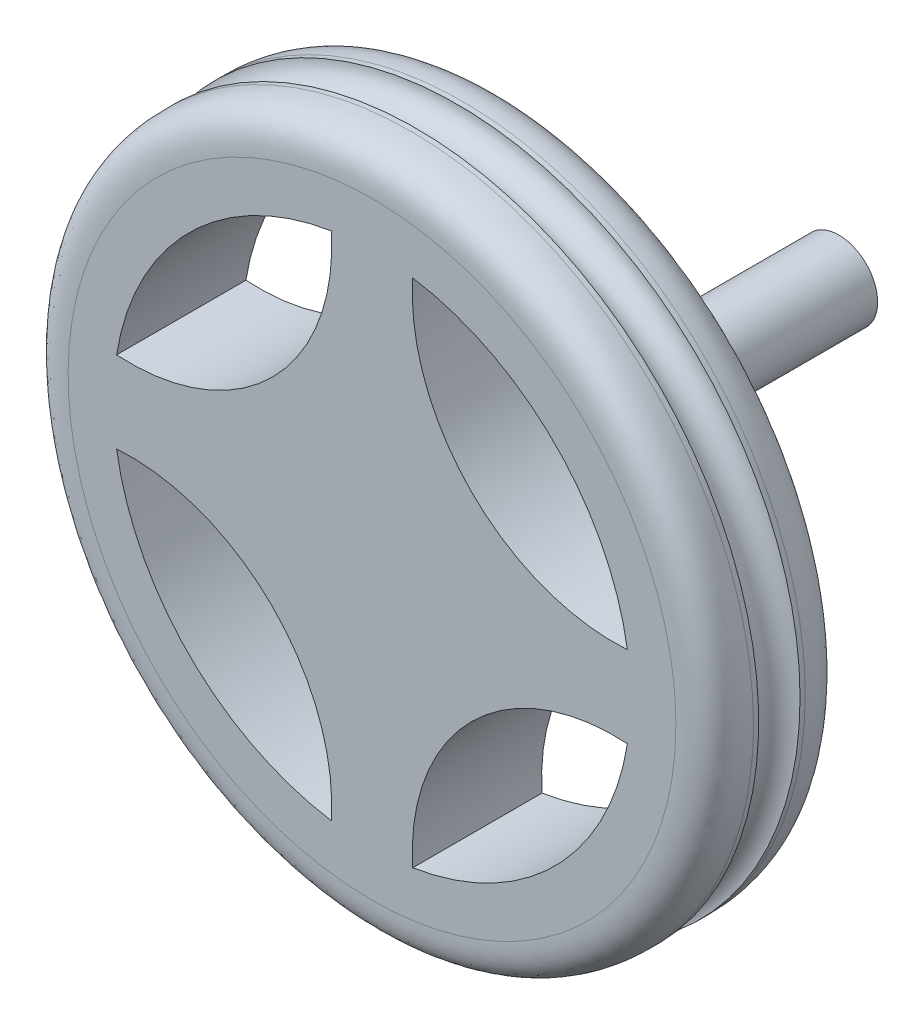
ISO-10303-21;
HEADER;
FILE_DESCRIPTION(('STEP AP214'),'2;1');
FILE_NAME('part.step','',(''),(''),'','','');
FILE_SCHEMA(('AUTOMOTIVE_DESIGN { 1 0 10303 214 1 1 1 1 }'));
ENDSEC;
DATA;
#1=APPLICATION_CONTEXT('core data for automotive mechanical design processes');
#2=APPLICATION_PROTOCOL_DEFINITION('international standard','automotive_design',2000,#1);
#3=PRODUCT_CONTEXT('',#1,'mechanical');
#4=PRODUCT('Part','Part','',(#3));
#5=PRODUCT_RELATED_PRODUCT_CATEGORY('part','',(#4));
#6=PRODUCT_DEFINITION_FORMATION('','',#4);
#7=PRODUCT_DEFINITION_CONTEXT('part definition',#1,'design');
#8=PRODUCT_DEFINITION('design','',#6,#7);
#9=PRODUCT_DEFINITION_SHAPE('','',#8);
#10=(LENGTH_UNIT() NAMED_UNIT(*) SI_UNIT(.MILLI.,.METRE.));
#11=(NAMED_UNIT(*) PLANE_ANGLE_UNIT() SI_UNIT($,.RADIAN.));
#12=(NAMED_UNIT(*) SI_UNIT($,.STERADIAN.) SOLID_ANGLE_UNIT());
#13=UNCERTAINTY_MEASURE_WITH_UNIT(LENGTH_MEASURE(1.E-05),#10,'distance_accuracy_value','');
#14=(GEOMETRIC_REPRESENTATION_CONTEXT(3) GLOBAL_UNCERTAINTY_ASSIGNED_CONTEXT((#13)) GLOBAL_UNIT_ASSIGNED_CONTEXT((#10,
#11,#12)) REPRESENTATION_CONTEXT('',''));
#15=CARTESIAN_POINT('',(0.,0.,0.));
#16=DIRECTION('',(0.,0.,1.));
#17=DIRECTION('',(1.,0.,0.));
#18=AXIS2_PLACEMENT_3D('',#15,#16,#17);
#19=CARTESIAN_POINT('',(4.49639746502567,34.7438056757314,20.));
#20=DIRECTION('',(0.,0.,-1.));
#21=DIRECTION('',(-1.,0.,0.));
#22=AXIS2_PLACEMENT_3D('',#19,#20,#21);
#23=CYLINDRICAL_SURFACE('',#22,26.5);
#24=CARTESIAN_POINT('',(30.9963974650257,34.7438056757314,17.));
#25=CARTESIAN_POINT('',(30.9963974650257,38.2121807728972,17.));
#26=CARTESIAN_POINT('',(29.6165920619499,45.1489309672287,17.));
#27=CARTESIAN_POINT('',(23.7225620450856,53.9699702557912,17.));
#28=CARTESIAN_POINT('',(14.9015227565231,59.8640002726556,17.));
#29=CARTESIAN_POINT('',(4.49639746502556,61.9337083772693,17.));
#30=CARTESIAN_POINT('',(-5.9087278264716,59.8640002726556,17.));
#31=CARTESIAN_POINT('',(-14.7297671150342,53.9699702557913,17.));
#32=CARTESIAN_POINT('',(-20.6237971318985,45.1489309672288,17.));
#33=CARTESIAN_POINT('',(-22.6935052365122,34.7438056757313,17.));
#34=CARTESIAN_POINT('',(-20.6237971318986,24.3386803842342,17.));
#35=CARTESIAN_POINT('',(-14.7297671150342,15.5176410956715,17.));
#36=CARTESIAN_POINT('',(-5.90872782647176,9.62361107880723,17.));
#37=CARTESIAN_POINT('',(4.49639746502572,7.55390297419349,17.));
#38=CARTESIAN_POINT('',(14.901522756523,9.62361107880719,17.));
#39=CARTESIAN_POINT('',(23.7225620450856,15.5176410956715,17.));
#40=CARTESIAN_POINT('',(29.6165920619499,24.3386803842341,17.));
#41=CARTESIAN_POINT('',(30.9963974650257,31.2754305785656,17.));
#42=CARTESIAN_POINT('',(30.9963974650257,34.7438056757314,17.));
#43=B_SPLINE_CURVE_WITH_KNOTS('',3,(#24,#25,#26,#27,#28,#29,#30,#31,#32,#33,#34,#35,#36,#37,#38,
#39,#40,#41,#42),.UNSPECIFIED.,.T.,.F.,(4,1,1,1,1,1,1,1,1,1,1,1,1,1,1,1,4),(-6.28318530717959,
-5.89048622548086,-5.49778714378214,-5.10508806208341,-4.71238898038469,-4.31968989868597,
-3.92699081698724,-3.53429173528852,-3.14159265358979,-2.74889357189107,-2.35619449019235,
-1.96349540849362,-1.5707963267949,-1.17809724509617,-0.785398163397448,-0.392699081698724,0.),.UNSPECIFIED.);
#44=CARTESIAN_POINT('',(30.9963974650257,34.7438056757314,17.));
#45=VERTEX_POINT('',#44);
#46=EDGE_CURVE('E175',#45,#45,#43,.F.);
#47=ORIENTED_EDGE('',*,*,#46,.T.);
#48=EDGE_LOOP('',(#47));
#49=FACE_BOUND('',#48,.T.);
#50=CARTESIAN_POINT('',(4.49639746502567,34.7438056757314,16.6));
#51=DIRECTION('',(0.,0.,-1.));
#52=DIRECTION('',(-1.,0.,0.));
#53=AXIS2_PLACEMENT_3D('',#50,#51,#52);
#54=CIRCLE('',#53,26.5);
#55=CARTESIAN_POINT('',(-22.0036025349743,34.7438056757314,16.6));
#56=VERTEX_POINT('',#55);
#57=EDGE_CURVE('E145',#56,#56,#54,.F.);
#58=ORIENTED_EDGE('',*,*,#57,.T.);
#59=EDGE_LOOP('',(#58));
#60=FACE_BOUND('',#59,.T.);
#61=ADVANCED_FACE('F41',(#49,#60),#23,.T.);
#62=CARTESIAN_POINT('',(30.9963974650257,34.7438056757314,13.));
#63=CARTESIAN_POINT('',(30.9963974650257,31.2754305785656,13.));
#64=CARTESIAN_POINT('',(29.6165920619499,24.3386803842341,13.));
#65=CARTESIAN_POINT('',(23.7225620450856,15.5176410956715,13.));
#66=CARTESIAN_POINT('',(14.901522756523,9.62361107880719,13.));
#67=CARTESIAN_POINT('',(4.49639746502572,7.55390297419349,13.));
#68=CARTESIAN_POINT('',(-5.90872782647176,9.62361107880723,13.));
#69=CARTESIAN_POINT('',(-14.7297671150342,15.5176410956715,13.));
#70=CARTESIAN_POINT('',(-20.6237971318986,24.3386803842342,13.));
#71=CARTESIAN_POINT('',(-22.6935052365122,34.7438056757313,13.));
#72=CARTESIAN_POINT('',(-20.6237971318985,45.1489309672288,13.));
#73=CARTESIAN_POINT('',(-14.7297671150342,53.9699702557913,13.));
#74=CARTESIAN_POINT('',(-5.9087278264716,59.8640002726556,13.));
#75=CARTESIAN_POINT('',(4.49639746502556,61.9337083772693,13.));
#76=CARTESIAN_POINT('',(14.9015227565231,59.8640002726556,13.));
#77=CARTESIAN_POINT('',(23.7225620450856,53.9699702557912,13.));
#78=CARTESIAN_POINT('',(29.6165920619499,45.1489309672287,13.));
#79=CARTESIAN_POINT('',(30.9963974650257,38.2121807728972,13.));
#80=CARTESIAN_POINT('',(30.9963974650257,34.7438056757314,13.));
#81=B_SPLINE_CURVE_WITH_KNOTS('',3,(#62,#63,#64,#65,#66,#67,#68,#69,#70,#71,#72,#73,#74,#75,#76,
#77,#78,#79,#80),.UNSPECIFIED.,.T.,.F.,(4,1,1,1,1,1,1,1,1,1,1,1,1,1,1,1,4),(-6.28318530717959,
-5.89048622548086,-5.49778714378214,-5.10508806208341,-4.71238898038469,-4.31968989868597,
-3.92699081698724,-3.53429173528852,-3.14159265358979,-2.74889357189107,-2.35619449019234,
-1.96349540849362,-1.5707963267949,-1.17809724509617,-0.785398163397448,-0.392699081698724,0.),.UNSPECIFIED.);
#82=CARTESIAN_POINT('',(30.9963974650257,34.7438056757314,13.));
#83=VERTEX_POINT('',#82);
#84=EDGE_CURVE('E53',#83,#83,#81,.F.);
#85=ORIENTED_EDGE('',*,*,#84,.T.);
#86=EDGE_LOOP('',(#85));
#87=FACE_BOUND('',#86,.T.);
#88=CARTESIAN_POINT('',(4.49639746502567,34.7438056757314,13.4));
#89=DIRECTION('',(0.,0.,1.));
#90=DIRECTION('',(1.,0.,0.));
#91=AXIS2_PLACEMENT_3D('',#88,#89,#90);
#92=CIRCLE('',#91,26.5);
#93=CARTESIAN_POINT('',(30.9963974650257,34.7438056757314,13.4));
#94=VERTEX_POINT('',#93);
#95=EDGE_CURVE('E176',#94,#94,#92,.F.);
#96=ORIENTED_EDGE('',*,*,#95,.T.);
#97=EDGE_LOOP('',(#96));
#98=FACE_BOUND('',#97,.T.);
#99=ADVANCED_FACE('F199',(#87,#98),#23,.T.);
#100=CARTESIAN_POINT('',(23.2347271664692,16.0054759742879,20.));
#101=DIRECTION('',(0.,0.,-1.));
#102=DIRECTION('',(-1.,0.,0.));
#103=AXIS2_PLACEMENT_3D('',#100,#101,#102);
#104=CYLINDRICAL_SURFACE('',#103,15.6240206666318);
#105=CARTESIAN_POINT('',(23.2347271664692,16.0054759742879,10.));
#106=DIRECTION('',(0.,0.,1.));
#107=DIRECTION('',(1.,0.,0.));
#108=AXIS2_PLACEMENT_3D('',#105,#106,#107);
#109=CIRCLE('',#108,15.6240206666318);
#110=CARTESIAN_POINT('',(7.64354834771268,14.9929717358289,10.));
#111=VERTEX_POINT('',#110);
#112=CARTESIAN_POINT('',(24.2472314049281,31.5966547930444,10.));
#113=VERTEX_POINT('',#112);
#114=EDGE_CURVE('E140',#111,#113,#109,.F.);
#115=ORIENTED_EDGE('',*,*,#114,.T.);
#116=DIRECTION('',(0.,0.,-1.));
#117=VECTOR('',#116,1.);
#118=CARTESIAN_POINT('',(24.2472314049281,31.5966547930444,20.));
#119=LINE('',#118,#117);
#120=CARTESIAN_POINT('',(24.2472314049281,31.5966547930444,20.));
#121=VERTEX_POINT('',#120);
#122=EDGE_CURVE('E170',#121,#113,#119,.T.);
#123=ORIENTED_EDGE('',*,*,#122,.F.);
#124=CARTESIAN_POINT('',(23.2347271664692,16.0054759742879,20.));
#125=DIRECTION('',(0.,0.,1.));
#126=DIRECTION('',(1.,0.,0.));
#127=AXIS2_PLACEMENT_3D('',#124,#125,#126);
#128=CIRCLE('',#127,15.6240206666318);
#129=CARTESIAN_POINT('',(7.64354834771268,14.9929717358289,20.));
#130=VERTEX_POINT('',#129);
#131=EDGE_CURVE('E95',#130,#121,#128,.F.);
#132=ORIENTED_EDGE('',*,*,#131,.F.);
#133=DIRECTION('',(0.,0.,-1.));
#134=VECTOR('',#133,1.);
#135=CARTESIAN_POINT('',(7.64354834771268,14.9929717358289,20.));
#136=LINE('',#135,#134);
#137=EDGE_CURVE('E173',#130,#111,#136,.T.);
#138=ORIENTED_EDGE('',*,*,#137,.T.);
#139=EDGE_LOOP('',(#115,#123,#132,#138));
#140=FACE_BOUND('',#139,.T.);
#141=ADVANCED_FACE('F239',(#140),#104,.F.);
#142=CARTESIAN_POINT('',(23.2347271664692,53.4821353771749,20.));
#143=DIRECTION('',(0.,0.,-1.));
#144=DIRECTION('',(-1.,0.,0.));
#145=AXIS2_PLACEMENT_3D('',#142,#143,#144);
#146=CYLINDRICAL_SURFACE('',#145,15.6240206666318);
#147=CARTESIAN_POINT('',(23.2347271664692,53.4821353771749,10.));
#148=DIRECTION('',(0.,0.,1.));
#149=DIRECTION('',(1.,0.,0.));
#150=AXIS2_PLACEMENT_3D('',#147,#148,#149);
#151=CIRCLE('',#150,15.6240206666318);
#152=CARTESIAN_POINT('',(7.64354834771268,54.4946396156338,10.));
#153=VERTEX_POINT('',#152);
#154=CARTESIAN_POINT('',(24.2472314049281,37.8909565584184,10.));
#155=VERTEX_POINT('',#154);
#156=EDGE_CURVE('E156',#153,#155,#151,.T.);
#157=ORIENTED_EDGE('',*,*,#156,.F.);
#158=DIRECTION('',(0.,0.,-1.));
#159=VECTOR('',#158,1.);
#160=CARTESIAN_POINT('',(7.64354834771268,54.4946396156338,20.));
#161=LINE('',#160,#159);
#162=CARTESIAN_POINT('',(7.64354834771268,54.4946396156338,20.));
#163=VERTEX_POINT('',#162);
#164=EDGE_CURVE('E164',#163,#153,#161,.T.);
#165=ORIENTED_EDGE('',*,*,#164,.F.);
#166=CARTESIAN_POINT('',(23.2347271664692,53.4821353771749,20.));
#167=DIRECTION('',(0.,0.,1.));
#168=DIRECTION('',(1.,0.,0.));
#169=AXIS2_PLACEMENT_3D('',#166,#167,#168);
#170=CIRCLE('',#169,15.6240206666318);
#171=CARTESIAN_POINT('',(24.2472314049281,37.8909565584184,20.));
#172=VERTEX_POINT('',#171);
#173=EDGE_CURVE('E122',#163,#172,#170,.T.);
#174=ORIENTED_EDGE('',*,*,#173,.T.);
#175=DIRECTION('',(0.,0.,-1.));
#176=VECTOR('',#175,1.);
#177=CARTESIAN_POINT('',(24.2472314049281,37.8909565584184,20.));
#178=LINE('',#177,#176);
#179=EDGE_CURVE('E167',#172,#155,#178,.T.);
#180=ORIENTED_EDGE('',*,*,#179,.T.);
#181=EDGE_LOOP('',(#157,#165,#174,#180));
#182=FACE_BOUND('',#181,.T.);
#183=ADVANCED_FACE('F479',(#182),#146,.F.);
#184=CARTESIAN_POINT('',(-14.2419322364178,53.4821353771749,20.));
#185=DIRECTION('',(0.,0.,-1.));
#186=DIRECTION('',(-1.,0.,0.));
#187=AXIS2_PLACEMENT_3D('',#184,#185,#186);
#188=CYLINDRICAL_SURFACE('',#187,15.6240206666318);
#189=CARTESIAN_POINT('',(-14.2419322364178,53.4821353771749,10.));
#190=DIRECTION('',(0.,0.,1.));
#191=DIRECTION('',(1.,0.,0.));
#192=AXIS2_PLACEMENT_3D('',#189,#190,#191);
#193=CIRCLE('',#192,15.6240206666318);
#194=CARTESIAN_POINT('',(1.34924658233867,54.4946396156338,10.));
#195=VERTEX_POINT('',#194);
#196=CARTESIAN_POINT('',(-15.2544364748768,37.8909565584184,10.));
#197=VERTEX_POINT('',#196);
#198=EDGE_CURVE('E128',#195,#197,#193,.F.);
#199=ORIENTED_EDGE('',*,*,#198,.T.);
#200=DIRECTION('',(0.,0.,-1.));
#201=VECTOR('',#200,1.);
#202=CARTESIAN_POINT('',(-15.2544364748768,37.8909565584184,20.));
#203=LINE('',#202,#201);
#204=CARTESIAN_POINT('',(-15.2544364748768,37.8909565584184,20.));
#205=VERTEX_POINT('',#204);
#206=EDGE_CURVE('E125',#205,#197,#203,.T.);
#207=ORIENTED_EDGE('',*,*,#206,.F.);
#208=CARTESIAN_POINT('',(-14.2419322364178,53.4821353771749,20.));
#209=DIRECTION('',(0.,0.,1.));
#210=DIRECTION('',(1.,0.,0.));
#211=AXIS2_PLACEMENT_3D('',#208,#209,#210);
#212=CIRCLE('',#211,15.6240206666318);
#213=CARTESIAN_POINT('',(1.34924658233867,54.4946396156338,20.));
#214=VERTEX_POINT('',#213);
#215=EDGE_CURVE('E112',#214,#205,#212,.F.);
#216=ORIENTED_EDGE('',*,*,#215,.F.);
#217=DIRECTION('',(0.,0.,-1.));
#218=VECTOR('',#217,1.);
#219=CARTESIAN_POINT('',(1.34924658233867,54.4946396156338,20.));
#220=LINE('',#219,#218);
#221=EDGE_CURVE('E132',#214,#195,#220,.T.);
#222=ORIENTED_EDGE('',*,*,#221,.T.);
#223=EDGE_LOOP('',(#199,#207,#216,#222));
#224=FACE_BOUND('',#223,.T.);
#225=ADVANCED_FACE('F126',(#224),#188,.F.);
#226=CARTESIAN_POINT('',(-14.2419322364178,16.0054759742879,20.));
#227=DIRECTION('',(0.,0.,-1.));
#228=DIRECTION('',(-1.,0.,0.));
#229=AXIS2_PLACEMENT_3D('',#226,#227,#228);
#230=CYLINDRICAL_SURFACE('',#229,15.6240206666318);
#231=CARTESIAN_POINT('',(-14.2419322364178,16.0054759742879,10.));
#232=DIRECTION('',(0.,0.,1.));
#233=DIRECTION('',(1.,0.,0.));
#234=AXIS2_PLACEMENT_3D('',#231,#232,#233);
#235=CIRCLE('',#234,15.6240206666318);
#236=CARTESIAN_POINT('',(1.34924658233867,14.9929717358289,10.));
#237=VERTEX_POINT('',#236);
#238=CARTESIAN_POINT('',(-15.2544364748768,31.5966547930444,10.));
#239=VERTEX_POINT('',#238);
#240=EDGE_CURVE('E87',#237,#239,#235,.T.);
#241=ORIENTED_EDGE('',*,*,#240,.F.);
#242=DIRECTION('',(0.,0.,-1.));
#243=VECTOR('',#242,1.);
#244=CARTESIAN_POINT('',(1.34924658233867,14.9929717358289,20.));
#245=LINE('',#244,#243);
#246=CARTESIAN_POINT('',(1.34924658233867,14.9929717358289,20.));
#247=VERTEX_POINT('',#246);
#248=EDGE_CURVE('E68',#247,#237,#245,.T.);
#249=ORIENTED_EDGE('',*,*,#248,.F.);
#250=CARTESIAN_POINT('',(-14.2419322364178,16.0054759742879,20.));
#251=DIRECTION('',(0.,0.,1.));
#252=DIRECTION('',(1.,0.,0.));
#253=AXIS2_PLACEMENT_3D('',#250,#251,#252);
#254=CIRCLE('',#253,15.6240206666318);
#255=CARTESIAN_POINT('',(-15.2544364748768,31.5966547930444,20.));
#256=VERTEX_POINT('',#255);
#257=EDGE_CURVE('E121',#247,#256,#254,.T.);
#258=ORIENTED_EDGE('',*,*,#257,.T.);
#259=DIRECTION('',(0.,0.,-1.));
#260=VECTOR('',#259,1.);
#261=CARTESIAN_POINT('',(-15.2544364748768,31.5966547930444,20.));
#262=LINE('',#261,#260);
#263=EDGE_CURVE('E133',#256,#239,#262,.T.);
#264=ORIENTED_EDGE('',*,*,#263,.T.);
#265=EDGE_LOOP('',(#241,#249,#258,#264));
#266=FACE_BOUND('',#265,.T.);
#267=ADVANCED_FACE('F285',(#266),#230,.F.);
#268=CARTESIAN_POINT('',(0.,0.,20.));
#269=DIRECTION('',(0.,0.,1.));
#270=DIRECTION('',(1.,0.,0.));
#271=AXIS2_PLACEMENT_3D('',#268,#269,#270);
#272=PLANE('',#271);
#273=CARTESIAN_POINT('',(27.9963974650257,34.7438056757314,20.));
#274=CARTESIAN_POINT('',(27.9963974650257,31.6680768159806,20.));
#275=CARTESIAN_POINT('',(26.7727964472037,25.516619096479,20.));
#276=CARTESIAN_POINT('',(21.5460151114939,17.6941880292632,20.));
#277=CARTESIAN_POINT('',(13.723584044278,12.4674066935533,20.));
#278=CARTESIAN_POINT('',(4.49639746502572,10.6320051668204,20.));
#279=CARTESIAN_POINT('',(-4.73078911422677,12.4674066935534,20.));
#280=CARTESIAN_POINT('',(-12.5532201814425,17.6941880292631,20.));
#281=CARTESIAN_POINT('',(-17.7800015171524,25.5166190964791,20.));
#282=CARTESIAN_POINT('',(-19.6154030438853,34.7438056757313,20.));
#283=CARTESIAN_POINT('',(-17.7800015171524,43.9709922549838,20.));
#284=CARTESIAN_POINT('',(-12.5532201814425,51.7934233221996,20.));
#285=CARTESIAN_POINT('',(-4.73078911422662,57.0202046579095,20.));
#286=CARTESIAN_POINT('',(4.49639746502558,58.8556061846424,20.));
#287=CARTESIAN_POINT('',(13.7235840442781,57.0202046579095,20.));
#288=CARTESIAN_POINT('',(21.5460151114939,51.7934233221996,20.));
#289=CARTESIAN_POINT('',(26.7727964472038,43.9709922549837,20.));
#290=CARTESIAN_POINT('',(27.9963974650257,37.8195345354822,20.));
#291=CARTESIAN_POINT('',(27.9963974650257,34.7438056757314,20.));
#292=B_SPLINE_CURVE_WITH_KNOTS('',3,(#273,#274,#275,#276,#277,#278,#279,#280,#281,#282,#283,
#284,#285,#286,#287,#288,#289,#290,#291),.UNSPECIFIED.,.T.,.F.,(4,1,1,1,1,1,1,1,1,1,1,1,1,1,1,1,
4),(-6.28318530717959,-5.89048622548086,-5.49778714378214,-5.10508806208341,-4.71238898038469,
-4.31968989868597,-3.92699081698724,-3.53429173528852,-3.14159265358979,-2.74889357189107,
-2.35619449019234,-1.96349540849362,-1.5707963267949,-1.17809724509617,-0.785398163397448,
-0.392699081698724,0.),.UNSPECIFIED.);
#293=CARTESIAN_POINT('',(27.9963974650257,34.7438056757314,20.));
#294=VERTEX_POINT('',#293);
#295=EDGE_CURVE('E278',#294,#294,#292,.F.);
#296=ORIENTED_EDGE('',*,*,#295,.T.);
#297=EDGE_LOOP('',(#296));
#298=FACE_BOUND('',#297,.T.);
#299=CARTESIAN_POINT('',(4.49639746502567,34.7438056757314,20.));
#300=DIRECTION('',(0.,0.,1.));
#301=DIRECTION('',(1.,0.,0.));
#302=AXIS2_PLACEMENT_3D('',#299,#300,#301);
#303=CIRCLE('',#302,20.);
#304=EDGE_CURVE('E141',#130,#121,#303,.T.);
#305=ORIENTED_EDGE('',*,*,#304,.F.);
#306=ORIENTED_EDGE('',*,*,#131,.T.);
#307=EDGE_LOOP('',(#305,#306));
#308=FACE_BOUND('',#307,.T.);
#309=EDGE_CURVE('E137',#256,#247,#303,.T.);
#310=ORIENTED_EDGE('',*,*,#309,.F.);
#311=ORIENTED_EDGE('',*,*,#257,.F.);
#312=EDGE_LOOP('',(#310,#311));
#313=FACE_BOUND('',#312,.T.);
#314=EDGE_CURVE('E117',#214,#205,#303,.T.);
#315=ORIENTED_EDGE('',*,*,#314,.F.);
#316=ORIENTED_EDGE('',*,*,#215,.T.);
#317=EDGE_LOOP('',(#315,#316));
#318=FACE_BOUND('',#317,.T.);
#319=ORIENTED_EDGE('',*,*,#173,.F.);
#320=EDGE_CURVE('E136',#172,#163,#303,.T.);
#321=ORIENTED_EDGE('',*,*,#320,.F.);
#322=EDGE_LOOP('',(#319,#321));
#323=FACE_BOUND('',#322,.T.);
#324=ADVANCED_FACE('F114',(#298,#308,#313,#318,#323),#272,.T.);
#325=CARTESIAN_POINT('',(0.,0.,10.));
#326=DIRECTION('',(0.,0.,1.));
#327=DIRECTION('',(1.,0.,0.));
#328=AXIS2_PLACEMENT_3D('',#325,#326,#327);
#329=PLANE('',#328);
#330=CARTESIAN_POINT('',(4.49639746502568,34.7438056757314,10.));
#331=DIRECTION('',(0.,0.,1.));
#332=DIRECTION('',(1.,0.,0.));
#333=AXIS2_PLACEMENT_3D('',#330,#331,#332);
#334=CIRCLE('',#333,3.);
#335=CARTESIAN_POINT('',(7.49639746502568,34.7438056757314,10.));
#336=VERTEX_POINT('',#335);
#337=EDGE_CURVE('E11',#336,#336,#334,.F.);
#338=ORIENTED_EDGE('',*,*,#337,.F.);
#339=EDGE_LOOP('',(#338));
#340=FACE_BOUND('',#339,.T.);
#341=CARTESIAN_POINT('',(27.9963974650257,34.7438056757314,10.));
#342=CARTESIAN_POINT('',(27.9963974650257,37.8195345354822,10.));
#343=CARTESIAN_POINT('',(26.7727964472038,43.9709922549837,10.));
#344=CARTESIAN_POINT('',(21.5460151114939,51.7934233221996,10.));
#345=CARTESIAN_POINT('',(13.7235840442781,57.0202046579095,10.));
#346=CARTESIAN_POINT('',(4.49639746502558,58.8556061846424,10.));
#347=CARTESIAN_POINT('',(-4.73078911422663,57.0202046579095,10.));
#348=CARTESIAN_POINT('',(-12.5532201814425,51.7934233221996,10.));
#349=CARTESIAN_POINT('',(-17.7800015171524,43.9709922549838,10.));
#350=CARTESIAN_POINT('',(-19.6154030438853,34.7438056757313,10.));
#351=CARTESIAN_POINT('',(-17.7800015171525,25.5166190964791,10.));
#352=CARTESIAN_POINT('',(-12.5532201814425,17.6941880292631,10.));
#353=CARTESIAN_POINT('',(-4.73078911422678,12.4674066935534,10.));
#354=CARTESIAN_POINT('',(4.49639746502572,10.6320051668204,10.));
#355=CARTESIAN_POINT('',(13.723584044278,12.4674066935533,10.));
#356=CARTESIAN_POINT('',(21.5460151114939,17.6941880292632,10.));
#357=CARTESIAN_POINT('',(26.7727964472037,25.516619096479,10.));
#358=CARTESIAN_POINT('',(27.9963974650257,31.6680768159806,10.));
#359=CARTESIAN_POINT('',(27.9963974650257,34.7438056757314,10.));
#360=B_SPLINE_CURVE_WITH_KNOTS('',3,(#341,#342,#343,#344,#345,#346,#347,#348,#349,#350,#351,
#352,#353,#354,#355,#356,#357,#358,#359),.UNSPECIFIED.,.T.,.F.,(4,1,1,1,1,1,1,1,1,1,1,1,1,1,1,1,
4),(-6.28318530717959,-5.89048622548086,-5.49778714378214,-5.10508806208341,-4.71238898038469,
-4.31968989868597,-3.92699081698724,-3.53429173528852,-3.14159265358979,-2.74889357189107,
-2.35619449019235,-1.96349540849362,-1.5707963267949,-1.17809724509617,-0.785398163397448,
-0.392699081698724,0.),.UNSPECIFIED.);
#361=CARTESIAN_POINT('',(27.9963974650257,34.7438056757314,10.));
#362=VERTEX_POINT('',#361);
#363=EDGE_CURVE('E259',#362,#362,#360,.F.);
#364=ORIENTED_EDGE('',*,*,#363,.T.);
#365=EDGE_LOOP('',(#364));
#366=FACE_BOUND('',#365,.T.);
#367=ORIENTED_EDGE('',*,*,#114,.F.);
#368=CARTESIAN_POINT('',(4.49639746502567,34.7438056757314,10.));
#369=DIRECTION('',(0.,0.,1.));
#370=DIRECTION('',(1.,0.,0.));
#371=AXIS2_PLACEMENT_3D('',#368,#369,#370);
#372=CIRCLE('',#371,20.);
#373=EDGE_CURVE('E151',#111,#113,#372,.T.);
#374=ORIENTED_EDGE('',*,*,#373,.T.);
#375=EDGE_LOOP('',(#367,#374));
#376=FACE_BOUND('',#375,.T.);
#377=ORIENTED_EDGE('',*,*,#240,.T.);
#378=EDGE_CURVE('E295',#239,#237,#372,.T.);
#379=ORIENTED_EDGE('',*,*,#378,.T.);
#380=EDGE_LOOP('',(#377,#379));
#381=FACE_BOUND('',#380,.T.);
#382=ORIENTED_EDGE('',*,*,#198,.F.);
#383=EDGE_CURVE('E150',#195,#197,#372,.T.);
#384=ORIENTED_EDGE('',*,*,#383,.T.);
#385=EDGE_LOOP('',(#382,#384));
#386=FACE_BOUND('',#385,.T.);
#387=EDGE_CURVE('E147',#155,#153,#372,.T.);
#388=ORIENTED_EDGE('',*,*,#387,.T.);
#389=ORIENTED_EDGE('',*,*,#156,.T.);
#390=EDGE_LOOP('',(#388,#389));
#391=FACE_BOUND('',#390,.T.);
#392=ADVANCED_FACE('F284',(#340,#366,#376,#381,#386,#391),#329,.F.);
#393=CARTESIAN_POINT('',(4.49639746502567,34.7438056757314,20.));
#394=DIRECTION('',(0.,0.,-1.));
#395=DIRECTION('',(-1.,0.,0.));
#396=AXIS2_PLACEMENT_3D('',#393,#394,#395);
#397=CYLINDRICAL_SURFACE('',#396,20.);
#398=ORIENTED_EDGE('',*,*,#122,.T.);
#399=ORIENTED_EDGE('',*,*,#373,.F.);
#400=ORIENTED_EDGE('',*,*,#137,.F.);
#401=ORIENTED_EDGE('',*,*,#304,.T.);
#402=EDGE_LOOP('',(#398,#399,#400,#401));
#403=FACE_BOUND('',#402,.T.);
#404=ADVANCED_FACE('F387',(#403),#397,.F.);
#405=ORIENTED_EDGE('',*,*,#206,.T.);
#406=ORIENTED_EDGE('',*,*,#383,.F.);
#407=ORIENTED_EDGE('',*,*,#221,.F.);
#408=ORIENTED_EDGE('',*,*,#314,.T.);
#409=EDGE_LOOP('',(#405,#406,#407,#408));
#410=FACE_BOUND('',#409,.T.);
#411=ADVANCED_FACE('F135',(#410),#397,.F.);
#412=ORIENTED_EDGE('',*,*,#320,.T.);
#413=ORIENTED_EDGE('',*,*,#164,.T.);
#414=ORIENTED_EDGE('',*,*,#387,.F.);
#415=ORIENTED_EDGE('',*,*,#179,.F.);
#416=EDGE_LOOP('',(#412,#413,#414,#415));
#417=FACE_BOUND('',#416,.T.);
#418=ADVANCED_FACE('F441',(#417),#397,.F.);
#419=ORIENTED_EDGE('',*,*,#309,.T.);
#420=ORIENTED_EDGE('',*,*,#248,.T.);
#421=ORIENTED_EDGE('',*,*,#378,.F.);
#422=ORIENTED_EDGE('',*,*,#263,.F.);
#423=EDGE_LOOP('',(#419,#420,#421,#422));
#424=FACE_BOUND('',#423,.T.);
#425=ADVANCED_FACE('F202',(#424),#397,.F.);
#426=CARTESIAN_POINT('',(4.49639746502567,34.7438056757314,15.));
#427=DIRECTION('',(0.,0.,-1.));
#428=DIRECTION('',(-1.,0.,0.));
#429=AXIS2_PLACEMENT_3D('',#426,#427,#428);
#430=TOROIDAL_SURFACE('',#429,26.4999999936344,1.6);
#431=ORIENTED_EDGE('',*,*,#57,.F.);
#432=EDGE_LOOP('',(#431));
#433=FACE_BOUND('',#432,.T.);
#434=ORIENTED_EDGE('',*,*,#95,.F.);
#435=EDGE_LOOP('',(#434));
#436=FACE_BOUND('',#435,.T.);
#437=ADVANCED_FACE('F200',(#433,#436),#430,.F.);
#438=CARTESIAN_POINT('',(27.9963974650257,34.7438056757314,20.));
#439=CARTESIAN_POINT('',(27.9963974650257,37.8195345354822,20.));
#440=CARTESIAN_POINT('',(26.7727964472038,43.9709922549837,20.));
#441=CARTESIAN_POINT('',(21.5460151114939,51.7934233221996,20.));
#442=CARTESIAN_POINT('',(13.7235840442781,57.0202046579095,20.));
#443=CARTESIAN_POINT('',(4.49639746502558,58.8556061846424,20.));
#444=CARTESIAN_POINT('',(-4.73078911422662,57.0202046579095,20.));
#445=CARTESIAN_POINT('',(-12.5532201814425,51.7934233221996,20.));
#446=CARTESIAN_POINT('',(-17.7800015171524,43.9709922549838,20.));
#447=CARTESIAN_POINT('',(-19.6154030438853,34.7438056757313,20.));
#448=CARTESIAN_POINT('',(-17.7800015171524,25.5166190964791,20.));
#449=CARTESIAN_POINT('',(-12.5532201814425,17.6941880292631,20.));
#450=CARTESIAN_POINT('',(-4.73078911422677,12.4674066935534,20.));
#451=CARTESIAN_POINT('',(4.49639746502572,10.6320051668204,20.));
#452=CARTESIAN_POINT('',(13.723584044278,12.4674066935533,20.));
#453=CARTESIAN_POINT('',(21.5460151114939,17.6941880292632,20.));
#454=CARTESIAN_POINT('',(26.7727964472037,25.516619096479,20.));
#455=CARTESIAN_POINT('',(27.9963974650257,31.6680768159806,20.));
#456=CARTESIAN_POINT('',(27.9963974650257,34.7438056757314,20.));
#457=CARTESIAN_POINT('',(28.5009916196275,34.7438056757314,20.));
#458=CARTESIAN_POINT('',(28.5009916196275,37.8855768675575,20.));
#459=CARTESIAN_POINT('',(27.2511173285648,44.1691192512097,20.));
#460=CARTESIAN_POINT('',(21.9121060647962,52.1595142755019,20.));
#461=CARTESIAN_POINT('',(13.9217110405041,57.4985255392705,20.));
#462=CARTESIAN_POINT('',(4.49639746502557,59.3733369758646,20.));
#463=CARTESIAN_POINT('',(-4.92891611045264,57.4985255392706,20.));
#464=CARTESIAN_POINT('',(-12.9193111347448,52.159514275502,20.));
#465=CARTESIAN_POINT('',(-18.2583223985135,44.1691192512098,20.));
#466=CARTESIAN_POINT('',(-20.1331338351075,34.7438056757313,20.));
#467=CARTESIAN_POINT('',(-18.2583223985135,25.3184921002531,20.));
#468=CARTESIAN_POINT('',(-12.9193111347448,17.3280970759608,20.));
#469=CARTESIAN_POINT('',(-4.92891611045279,11.9890858121923,20.));
#470=CARTESIAN_POINT('',(4.49639746502572,10.1142743755982,20.));
#471=CARTESIAN_POINT('',(13.921711040504,11.9890858121922,20.));
#472=CARTESIAN_POINT('',(21.9121060647962,17.3280970759609,20.));
#473=CARTESIAN_POINT('',(27.2511173285648,25.318492100253,20.));
#474=CARTESIAN_POINT('',(28.5009916196275,31.6020344839053,20.));
#475=CARTESIAN_POINT('',(28.5009916196275,34.7438056757314,20.));
#476=CARTESIAN_POINT('',(29.0055857742294,34.7438056757314,20.));
#477=CARTESIAN_POINT('',(29.0055857742294,37.9516191996329,20.));
#478=CARTESIAN_POINT('',(27.7294382099259,44.3672462474357,20.));
#479=CARTESIAN_POINT('',(22.2781970180985,52.5256052288042,20.));
#480=CARTESIAN_POINT('',(14.1198380367301,57.9768464206316,20.));
#481=CARTESIAN_POINT('',(4.49639746502557,59.8910677670868,20.));
#482=CARTESIAN_POINT('',(-5.12704310667865,57.9768464206317,20.));
#483=CARTESIAN_POINT('',(-13.2854020880471,52.5256052288043,20.));
#484=CARTESIAN_POINT('',(-18.7366432798746,44.3672462474359,20.));
#485=CARTESIAN_POINT('',(-20.6508646263297,34.7438056757313,20.));
#486=CARTESIAN_POINT('',(-18.7366432798746,25.1203651040271,20.));
#487=CARTESIAN_POINT('',(-13.2854020880471,16.9620061226585,20.));
#488=CARTESIAN_POINT('',(-5.1270431066788,11.5107649308312,20.));
#489=CARTESIAN_POINT('',(4.49639746502572,9.59654358437599,20.));
#490=CARTESIAN_POINT('',(14.1198380367301,11.5107649308312,20.));
#491=CARTESIAN_POINT('',(22.2781970180985,16.9620061226586,20.));
#492=CARTESIAN_POINT('',(27.7294382099259,25.120365104027,20.));
#493=CARTESIAN_POINT('',(29.0055857742294,31.53599215183,20.));
#494=CARTESIAN_POINT('',(29.0055857742294,34.7438056757314,20.));
#495=CARTESIAN_POINT('',(30.1177178085853,34.7438056757314,19.7849242404918));
#496=CARTESIAN_POINT('',(30.1177178085853,38.0971773525657,19.7849242404918));
#497=CARTESIAN_POINT('',(28.7836636106993,44.8039207062343,19.7849242404918));
#498=CARTESIAN_POINT('',(23.0850662078074,53.332474418513,19.7849242404918));
#499=CARTESIAN_POINT('',(14.5565124955287,59.031071821405,19.7849242404917));
#500=CARTESIAN_POINT('',(4.49639746502557,61.032153118234,19.7849242404918));
#501=CARTESIAN_POINT('',(-5.56371756547719,59.0310718214051,19.7849242404918));
#502=CARTESIAN_POINT('',(-14.092271277756,53.3324744185131,19.7849242404918));
#503=CARTESIAN_POINT('',(-19.790868680648,44.8039207062344,19.7849242404918));
#504=CARTESIAN_POINT('',(-21.791949977477,34.7438056757313,19.7849242404917));
#505=CARTESIAN_POINT('',(-19.790868680648,24.6836906452286,19.7849242404918));
#506=CARTESIAN_POINT('',(-14.0922712777559,16.1551369329497,19.7849242404917));
#507=CARTESIAN_POINT('',(-5.56371756547736,10.4565395300578,19.7849242404918));
#508=CARTESIAN_POINT('',(4.49639746502572,8.45545823322874,19.7849242404918));
#509=CARTESIAN_POINT('',(14.5565124955286,10.4565395300578,19.7849242404918));
#510=CARTESIAN_POINT('',(23.0850662078074,16.1551369329498,19.7849242404918));
#511=CARTESIAN_POINT('',(28.7836636106993,24.6836906452285,19.7849242404918));
#512=CARTESIAN_POINT('',(30.1177178085853,31.3904339988971,19.7849242404918));
#513=CARTESIAN_POINT('',(30.1177178085853,34.7438056757314,19.7849242404918));
#514=CARTESIAN_POINT('',(30.7813217055174,34.7438056757314,19.1213203435596));
#515=CARTESIAN_POINT('',(30.7813217055174,38.1840312103205,19.1213203435596));
#516=CARTESIAN_POINT('',(29.4127148947073,45.0644822794986,19.1213203435596));
#517=CARTESIAN_POINT('',(23.5665212168031,53.8139294275087,19.1213203435596));
#518=CARTESIAN_POINT('',(14.817074068793,59.660123105413,19.1213203435596));
#519=CARTESIAN_POINT('',(4.49639746502557,61.7130333216282,19.1213203435596));
#520=CARTESIAN_POINT('',(-5.82427913874152,59.6601231054131,19.1213203435596));
#521=CARTESIAN_POINT('',(-14.5737262867516,53.8139294275088,19.1213203435596));
#522=CARTESIAN_POINT('',(-20.4199199646559,45.0644822794987,19.1213203435596));
#523=CARTESIAN_POINT('',(-22.4728301808711,34.7438056757313,19.1213203435596));
#524=CARTESIAN_POINT('',(-20.419919964656,24.4231290719642,19.1213203435597));
#525=CARTESIAN_POINT('',(-14.5737262867516,15.673681923954,19.1213203435596));
#526=CARTESIAN_POINT('',(-5.82427913874168,9.82748824604982,19.1213203435596));
#527=CARTESIAN_POINT('',(4.49639746502572,7.77457802983457,19.1213203435596));
#528=CARTESIAN_POINT('',(14.8170740687929,9.82748824604978,19.1213203435596));
#529=CARTESIAN_POINT('',(23.5665212168031,15.6736819239541,19.1213203435596));
#530=CARTESIAN_POINT('',(29.4127148947073,24.4231290719641,19.1213203435596));
#531=CARTESIAN_POINT('',(30.7813217055174,31.3035801411423,19.1213203435596));
#532=CARTESIAN_POINT('',(30.7813217055174,34.7438056757314,19.1213203435596));
#533=CARTESIAN_POINT('',(30.9963974650257,34.7438056757314,18.0091883092037));
#534=CARTESIAN_POINT('',(30.9963974650257,38.2121807728972,18.0091883092037));
#535=CARTESIAN_POINT('',(29.6165920619499,45.1489309672287,18.0091883092037));
#536=CARTESIAN_POINT('',(23.7225620450856,53.9699702557912,18.0091883092037));
#537=CARTESIAN_POINT('',(14.9015227565231,59.8640002726556,18.0091883092037));
#538=CARTESIAN_POINT('',(4.49639746502556,61.9337083772693,18.0091883092037));
#539=CARTESIAN_POINT('',(-5.9087278264716,59.8640002726556,18.0091883092037));
#540=CARTESIAN_POINT('',(-14.7297671150342,53.9699702557913,18.0091883092037));
#541=CARTESIAN_POINT('',(-20.6237971318985,45.1489309672288,18.0091883092037));
#542=CARTESIAN_POINT('',(-22.6935052365122,34.7438056757313,18.0091883092037));
#543=CARTESIAN_POINT('',(-20.6237971318986,24.3386803842342,18.0091883092037));
#544=CARTESIAN_POINT('',(-14.7297671150342,15.5176410956715,18.0091883092037));
#545=CARTESIAN_POINT('',(-5.90872782647176,9.62361107880723,18.0091883092037));
#546=CARTESIAN_POINT('',(4.49639746502572,7.55390297419349,18.0091883092037));
#547=CARTESIAN_POINT('',(14.901522756523,9.62361107880719,18.0091883092037));
#548=CARTESIAN_POINT('',(23.7225620450856,15.5176410956715,18.0091883092037));
#549=CARTESIAN_POINT('',(29.6165920619499,24.3386803842341,18.0091883092037));
#550=CARTESIAN_POINT('',(30.9963974650257,31.2754305785656,18.0091883092037));
#551=CARTESIAN_POINT('',(30.9963974650257,34.7438056757314,18.0091883092037));
#552=CARTESIAN_POINT('',(30.9963974650257,34.7438056757314,17.5045941546018));
#553=CARTESIAN_POINT('',(30.9963974650257,38.2121807728972,17.5045941546018));
#554=CARTESIAN_POINT('',(29.6165920619499,45.1489309672287,17.5045941546018));
#555=CARTESIAN_POINT('',(23.7225620450856,53.9699702557912,17.5045941546018));
#556=CARTESIAN_POINT('',(14.9015227565231,59.8640002726556,17.5045941546018));
#557=CARTESIAN_POINT('',(4.49639746502556,61.9337083772693,17.5045941546018));
#558=CARTESIAN_POINT('',(-5.9087278264716,59.8640002726556,17.5045941546018));
#559=CARTESIAN_POINT('',(-14.7297671150342,53.9699702557913,17.5045941546018));
#560=CARTESIAN_POINT('',(-20.6237971318985,45.1489309672288,17.5045941546018));
#561=CARTESIAN_POINT('',(-22.6935052365122,34.7438056757313,17.5045941546018));
#562=CARTESIAN_POINT('',(-20.6237971318986,24.3386803842342,17.5045941546019));
#563=CARTESIAN_POINT('',(-14.7297671150342,15.5176410956715,17.5045941546018));
#564=CARTESIAN_POINT('',(-5.90872782647176,9.62361107880723,17.5045941546019));
#565=CARTESIAN_POINT('',(4.49639746502572,7.55390297419349,17.5045941546018));
#566=CARTESIAN_POINT('',(14.901522756523,9.62361107880719,17.5045941546018));
#567=CARTESIAN_POINT('',(23.7225620450856,15.5176410956715,17.5045941546018));
#568=CARTESIAN_POINT('',(29.6165920619499,24.3386803842341,17.5045941546018));
#569=CARTESIAN_POINT('',(30.9963974650257,31.2754305785656,17.5045941546018));
#570=CARTESIAN_POINT('',(30.9963974650257,34.7438056757314,17.5045941546018));
#571=CARTESIAN_POINT('',(30.9963974650257,34.7438056757314,17.));
#572=CARTESIAN_POINT('',(30.9963974650257,38.2121807728972,17.));
#573=CARTESIAN_POINT('',(29.6165920619499,45.1489309672287,17.));
#574=CARTESIAN_POINT('',(23.7225620450856,53.9699702557912,17.));
#575=CARTESIAN_POINT('',(14.9015227565231,59.8640002726556,17.));
#576=CARTESIAN_POINT('',(4.49639746502556,61.9337083772693,17.));
#577=CARTESIAN_POINT('',(-5.9087278264716,59.8640002726556,17.));
#578=CARTESIAN_POINT('',(-14.7297671150342,53.9699702557913,17.));
#579=CARTESIAN_POINT('',(-20.6237971318985,45.1489309672288,17.));
#580=CARTESIAN_POINT('',(-22.6935052365122,34.7438056757313,17.));
#581=CARTESIAN_POINT('',(-20.6237971318986,24.3386803842342,17.));
#582=CARTESIAN_POINT('',(-14.7297671150342,15.5176410956715,17.));
#583=CARTESIAN_POINT('',(-5.90872782647176,9.62361107880723,17.));
#584=CARTESIAN_POINT('',(4.49639746502572,7.55390297419349,17.));
#585=CARTESIAN_POINT('',(14.901522756523,9.62361107880719,17.));
#586=CARTESIAN_POINT('',(23.7225620450856,15.5176410956715,17.));
#587=CARTESIAN_POINT('',(29.6165920619499,24.3386803842341,17.));
#588=CARTESIAN_POINT('',(30.9963974650257,31.2754305785656,17.));
#589=CARTESIAN_POINT('',(30.9963974650257,34.7438056757314,17.));
#590=B_SPLINE_SURFACE_WITH_KNOTS('',5,3,((#438,#439,#440,#441,#442,#443,#444,#445,#446,#447,
#448,#449,#450,#451,#452,#453,#454,#455,#456),(#457,#458,#459,#460,#461,#462,#463,#464,#465,
#466,#467,#468,#469,#470,#471,#472,#473,#474,#475),(#476,#477,#478,#479,#480,#481,#482,#483,
#484,#485,#486,#487,#488,#489,#490,#491,#492,#493,#494),(#495,#496,#497,#498,#499,#500,#501,
#502,#503,#504,#505,#506,#507,#508,#509,#510,#511,#512,#513),(#514,#515,#516,#517,#518,#519,
#520,#521,#522,#523,#524,#525,#526,#527,#528,#529,#530,#531,#532),(#533,#534,#535,#536,#537,
#538,#539,#540,#541,#542,#543,#544,#545,#546,#547,#548,#549,#550,#551),(#552,#553,#554,#555,
#556,#557,#558,#559,#560,#561,#562,#563,#564,#565,#566,#567,#568,#569,#570),(#571,#572,#573,
#574,#575,#576,#577,#578,#579,#580,#581,#582,#583,#584,#585,#586,#587,#588,#589)),.UNSPECIFIED.,
.F.,.T.,.F.,(6,2,6),(4,1,1,1,1,1,1,1,1,1,1,1,1,1,1,1,4),(0.,0.5,1.),(-6.28318530717959,
-5.89048622548086,-5.49778714378214,-5.10508806208341,-4.71238898038469,-4.31968989868597,
-3.92699081698724,-3.53429173528852,-3.14159265358979,-2.74889357189107,-2.35619449019235,
-1.96349540849362,-1.5707963267949,-1.17809724509617,-0.785398163397448,-0.392699081698724,0.),.UNSPECIFIED.);
#591=ORIENTED_EDGE('',*,*,#295,.F.);
#592=EDGE_LOOP('',(#591));
#593=FACE_BOUND('',#592,.T.);
#594=ORIENTED_EDGE('',*,*,#46,.F.);
#595=EDGE_LOOP('',(#594));
#596=FACE_BOUND('',#595,.T.);
#597=ADVANCED_FACE('F225',(#593,#596),#590,.T.);
#598=CARTESIAN_POINT('',(30.9963974650257,34.7438056757314,13.));
#599=CARTESIAN_POINT('',(30.9963974650257,38.2121807728972,13.));
#600=CARTESIAN_POINT('',(29.6165920619499,45.1489309672287,13.));
#601=CARTESIAN_POINT('',(23.7225620450856,53.9699702557912,13.));
#602=CARTESIAN_POINT('',(14.9015227565231,59.8640002726556,13.));
#603=CARTESIAN_POINT('',(4.49639746502556,61.9337083772693,13.));
#604=CARTESIAN_POINT('',(-5.9087278264716,59.8640002726556,13.));
#605=CARTESIAN_POINT('',(-14.7297671150342,53.9699702557913,13.));
#606=CARTESIAN_POINT('',(-20.6237971318985,45.1489309672288,13.));
#607=CARTESIAN_POINT('',(-22.6935052365122,34.7438056757313,13.));
#608=CARTESIAN_POINT('',(-20.6237971318986,24.3386803842342,13.));
#609=CARTESIAN_POINT('',(-14.7297671150342,15.5176410956715,13.));
#610=CARTESIAN_POINT('',(-5.90872782647176,9.62361107880723,13.));
#611=CARTESIAN_POINT('',(4.49639746502572,7.55390297419349,13.));
#612=CARTESIAN_POINT('',(14.901522756523,9.62361107880719,13.));
#613=CARTESIAN_POINT('',(23.7225620450856,15.5176410956715,13.));
#614=CARTESIAN_POINT('',(29.6165920619499,24.3386803842341,13.));
#615=CARTESIAN_POINT('',(30.9963974650257,31.2754305785656,13.));
#616=CARTESIAN_POINT('',(30.9963974650257,34.7438056757314,13.));
#617=CARTESIAN_POINT('',(30.9963974650257,34.7438056757314,12.4954058453982));
#618=CARTESIAN_POINT('',(30.9963974650257,38.2121807728972,12.4954058453982));
#619=CARTESIAN_POINT('',(29.6165920619499,45.1489309672287,12.4954058453982));
#620=CARTESIAN_POINT('',(23.7225620450856,53.9699702557912,12.4954058453982));
#621=CARTESIAN_POINT('',(14.9015227565231,59.8640002726556,12.4954058453982));
#622=CARTESIAN_POINT('',(4.49639746502556,61.9337083772693,12.4954058453982));
#623=CARTESIAN_POINT('',(-5.9087278264716,59.8640002726556,12.4954058453982));
#624=CARTESIAN_POINT('',(-14.7297671150342,53.9699702557913,12.4954058453982));
#625=CARTESIAN_POINT('',(-20.6237971318985,45.1489309672288,12.4954058453982));
#626=CARTESIAN_POINT('',(-22.6935052365122,34.7438056757313,12.4954058453982));
#627=CARTESIAN_POINT('',(-20.6237971318986,24.3386803842342,12.4954058453982));
#628=CARTESIAN_POINT('',(-14.7297671150342,15.5176410956715,12.4954058453982));
#629=CARTESIAN_POINT('',(-5.90872782647176,9.62361107880723,12.4954058453982));
#630=CARTESIAN_POINT('',(4.49639746502572,7.55390297419349,12.4954058453982));
#631=CARTESIAN_POINT('',(14.901522756523,9.62361107880719,12.4954058453982));
#632=CARTESIAN_POINT('',(23.7225620450856,15.5176410956715,12.4954058453982));
#633=CARTESIAN_POINT('',(29.6165920619499,24.3386803842341,12.4954058453982));
#634=CARTESIAN_POINT('',(30.9963974650257,31.2754305785656,12.4954058453982));
#635=CARTESIAN_POINT('',(30.9963974650257,34.7438056757314,12.4954058453982));
#636=CARTESIAN_POINT('',(30.9963974650257,34.7438056757314,11.9908116907963));
#637=CARTESIAN_POINT('',(30.9963974650257,38.2121807728972,11.9908116907963));
#638=CARTESIAN_POINT('',(29.6165920619499,45.1489309672287,11.9908116907963));
#639=CARTESIAN_POINT('',(23.7225620450856,53.9699702557912,11.9908116907963));
#640=CARTESIAN_POINT('',(14.9015227565231,59.8640002726556,11.9908116907963));
#641=CARTESIAN_POINT('',(4.49639746502557,61.9337083772693,11.9908116907963));
#642=CARTESIAN_POINT('',(-5.9087278264716,59.8640002726556,11.9908116907963));
#643=CARTESIAN_POINT('',(-14.7297671150342,53.9699702557913,11.9908116907963));
#644=CARTESIAN_POINT('',(-20.6237971318985,45.1489309672288,11.9908116907963));
#645=CARTESIAN_POINT('',(-22.6935052365122,34.7438056757313,11.9908116907963));
#646=CARTESIAN_POINT('',(-20.6237971318986,24.3386803842342,11.9908116907963));
#647=CARTESIAN_POINT('',(-14.7297671150342,15.5176410956715,11.9908116907963));
#648=CARTESIAN_POINT('',(-5.90872782647176,9.62361107880723,11.9908116907963));
#649=CARTESIAN_POINT('',(4.49639746502572,7.55390297419349,11.9908116907963));
#650=CARTESIAN_POINT('',(14.901522756523,9.62361107880719,11.9908116907963));
#651=CARTESIAN_POINT('',(23.7225620450856,15.5176410956715,11.9908116907963));
#652=CARTESIAN_POINT('',(29.6165920619499,24.3386803842341,11.9908116907963));
#653=CARTESIAN_POINT('',(30.9963974650257,31.2754305785656,11.9908116907963));
#654=CARTESIAN_POINT('',(30.9963974650257,34.7438056757314,11.9908116907963));
#655=CARTESIAN_POINT('',(30.7813217055174,34.7438056757314,10.8786796564404));
#656=CARTESIAN_POINT('',(30.7813217055174,38.1840312103205,10.8786796564404));
#657=CARTESIAN_POINT('',(29.4127148947073,45.0644822794986,10.8786796564403));
#658=CARTESIAN_POINT('',(23.5665212168031,53.8139294275087,10.8786796564404));
#659=CARTESIAN_POINT('',(14.817074068793,59.660123105413,10.8786796564404));
#660=CARTESIAN_POINT('',(4.49639746502557,61.7130333216282,10.8786796564404));
#661=CARTESIAN_POINT('',(-5.82427913874152,59.660123105413,10.8786796564404));
#662=CARTESIAN_POINT('',(-14.5737262867516,53.8139294275088,10.8786796564404));
#663=CARTESIAN_POINT('',(-20.4199199646559,45.0644822794987,10.8786796564404));
#664=CARTESIAN_POINT('',(-22.4728301808711,34.7438056757313,10.8786796564404));
#665=CARTESIAN_POINT('',(-20.419919964656,24.4231290719642,10.8786796564404));
#666=CARTESIAN_POINT('',(-14.5737262867516,15.673681923954,10.8786796564404));
#667=CARTESIAN_POINT('',(-5.82427913874168,9.82748824604981,10.8786796564404));
#668=CARTESIAN_POINT('',(4.49639746502572,7.77457802983457,10.8786796564404));
#669=CARTESIAN_POINT('',(14.8170740687929,9.82748824604978,10.8786796564404));
#670=CARTESIAN_POINT('',(23.5665212168031,15.6736819239541,10.8786796564404));
#671=CARTESIAN_POINT('',(29.4127148947073,24.4231290719641,10.8786796564404));
#672=CARTESIAN_POINT('',(30.7813217055174,31.3035801411423,10.8786796564404));
#673=CARTESIAN_POINT('',(30.7813217055174,34.7438056757314,10.8786796564404));
#674=CARTESIAN_POINT('',(30.1177178085853,34.7438056757314,10.2150757595083));
#675=CARTESIAN_POINT('',(30.1177178085853,38.0971773525657,10.2150757595083));
#676=CARTESIAN_POINT('',(28.7836636106993,44.8039207062343,10.2150757595082));
#677=CARTESIAN_POINT('',(23.0850662078074,53.332474418513,10.2150757595083));
#678=CARTESIAN_POINT('',(14.5565124955286,59.031071821405,10.2150757595083));
#679=CARTESIAN_POINT('',(4.49639746502557,61.032153118234,10.2150757595083));
#680=CARTESIAN_POINT('',(-5.5637175654772,59.0310718214051,10.2150757595083));
#681=CARTESIAN_POINT('',(-14.092271277756,53.3324744185131,10.2150757595083));
#682=CARTESIAN_POINT('',(-19.790868680648,44.8039207062344,10.2150757595083));
#683=CARTESIAN_POINT('',(-21.791949977477,34.7438056757313,10.2150757595083));
#684=CARTESIAN_POINT('',(-19.790868680648,24.6836906452286,10.2150757595083));
#685=CARTESIAN_POINT('',(-14.0922712777559,16.1551369329497,10.2150757595082));
#686=CARTESIAN_POINT('',(-5.56371756547735,10.4565395300578,10.2150757595083));
#687=CARTESIAN_POINT('',(4.49639746502572,8.45545823322874,10.2150757595082));
#688=CARTESIAN_POINT('',(14.5565124955286,10.4565395300578,10.2150757595083));
#689=CARTESIAN_POINT('',(23.0850662078074,16.1551369329498,10.2150757595082));
#690=CARTESIAN_POINT('',(28.7836636106993,24.6836906452285,10.2150757595082));
#691=CARTESIAN_POINT('',(30.1177178085853,31.3904339988971,10.2150757595083));
#692=CARTESIAN_POINT('',(30.1177178085853,34.7438056757314,10.2150757595083));
#693=CARTESIAN_POINT('',(29.0055857742294,34.7438056757314,10.));
#694=CARTESIAN_POINT('',(29.0055857742294,37.9516191996329,10.));
#695=CARTESIAN_POINT('',(27.7294382099259,44.3672462474357,10.));
#696=CARTESIAN_POINT('',(22.2781970180985,52.5256052288042,10.));
#697=CARTESIAN_POINT('',(14.1198380367301,57.9768464206316,10.));
#698=CARTESIAN_POINT('',(4.49639746502557,59.8910677670868,10.));
#699=CARTESIAN_POINT('',(-5.12704310667865,57.9768464206317,10.));
#700=CARTESIAN_POINT('',(-13.2854020880471,52.5256052288043,10.));
#701=CARTESIAN_POINT('',(-18.7366432798746,44.3672462474359,10.));
#702=CARTESIAN_POINT('',(-20.6508646263297,34.7438056757313,10.));
#703=CARTESIAN_POINT('',(-18.7366432798746,25.1203651040271,10.));
#704=CARTESIAN_POINT('',(-13.2854020880471,16.9620061226585,10.));
#705=CARTESIAN_POINT('',(-5.1270431066788,11.5107649308312,10.));
#706=CARTESIAN_POINT('',(4.49639746502572,9.59654358437598,10.));
#707=CARTESIAN_POINT('',(14.1198380367301,11.5107649308312,10.));
#708=CARTESIAN_POINT('',(22.2781970180985,16.9620061226586,10.));
#709=CARTESIAN_POINT('',(27.7294382099259,25.120365104027,10.));
#710=CARTESIAN_POINT('',(29.0055857742294,31.53599215183,10.));
#711=CARTESIAN_POINT('',(29.0055857742294,34.7438056757314,10.));
#712=CARTESIAN_POINT('',(28.5009916196275,34.7438056757314,10.));
#713=CARTESIAN_POINT('',(28.5009916196275,37.8855768675575,10.));
#714=CARTESIAN_POINT('',(27.2511173285648,44.1691192512097,10.));
#715=CARTESIAN_POINT('',(21.9121060647962,52.1595142755019,10.));
#716=CARTESIAN_POINT('',(13.9217110405041,57.4985255392705,10.));
#717=CARTESIAN_POINT('',(4.49639746502557,59.3733369758646,10.));
#718=CARTESIAN_POINT('',(-4.92891611045264,57.4985255392706,10.));
#719=CARTESIAN_POINT('',(-12.9193111347448,52.159514275502,10.));
#720=CARTESIAN_POINT('',(-18.2583223985135,44.1691192512098,10.));
#721=CARTESIAN_POINT('',(-20.1331338351075,34.7438056757313,10.));
#722=CARTESIAN_POINT('',(-18.2583223985135,25.3184921002531,10.));
#723=CARTESIAN_POINT('',(-12.9193111347448,17.3280970759608,10.));
#724=CARTESIAN_POINT('',(-4.92891611045279,11.9890858121923,10.));
#725=CARTESIAN_POINT('',(4.49639746502572,10.1142743755982,10.));
#726=CARTESIAN_POINT('',(13.921711040504,11.9890858121922,10.));
#727=CARTESIAN_POINT('',(21.9121060647962,17.3280970759609,10.));
#728=CARTESIAN_POINT('',(27.2511173285648,25.318492100253,10.));
#729=CARTESIAN_POINT('',(28.5009916196275,31.6020344839053,10.));
#730=CARTESIAN_POINT('',(28.5009916196275,34.7438056757314,10.));
#731=CARTESIAN_POINT('',(27.9963974650257,34.7438056757314,10.));
#732=CARTESIAN_POINT('',(27.9963974650257,37.8195345354822,10.));
#733=CARTESIAN_POINT('',(26.7727964472038,43.9709922549837,10.));
#734=CARTESIAN_POINT('',(21.5460151114939,51.7934233221996,10.));
#735=CARTESIAN_POINT('',(13.7235840442781,57.0202046579095,10.));
#736=CARTESIAN_POINT('',(4.49639746502558,58.8556061846424,10.));
#737=CARTESIAN_POINT('',(-4.73078911422662,57.0202046579095,10.));
#738=CARTESIAN_POINT('',(-12.5532201814425,51.7934233221996,10.));
#739=CARTESIAN_POINT('',(-17.7800015171524,43.9709922549838,10.));
#740=CARTESIAN_POINT('',(-19.6154030438853,34.7438056757313,10.));
#741=CARTESIAN_POINT('',(-17.7800015171524,25.5166190964791,10.));
#742=CARTESIAN_POINT('',(-12.5532201814425,17.6941880292631,10.));
#743=CARTESIAN_POINT('',(-4.73078911422677,12.4674066935534,10.));
#744=CARTESIAN_POINT('',(4.49639746502572,10.6320051668204,10.));
#745=CARTESIAN_POINT('',(13.723584044278,12.4674066935533,10.));
#746=CARTESIAN_POINT('',(21.5460151114939,17.6941880292632,10.));
#747=CARTESIAN_POINT('',(26.7727964472037,25.516619096479,10.));
#748=CARTESIAN_POINT('',(27.9963974650257,31.6680768159806,10.));
#749=CARTESIAN_POINT('',(27.9963974650257,34.7438056757314,10.));
#750=B_SPLINE_SURFACE_WITH_KNOTS('',5,3,((#598,#599,#600,#601,#602,#603,#604,#605,#606,#607,
#608,#609,#610,#611,#612,#613,#614,#615,#616),(#617,#618,#619,#620,#621,#622,#623,#624,#625,
#626,#627,#628,#629,#630,#631,#632,#633,#634,#635),(#636,#637,#638,#639,#640,#641,#642,#643,
#644,#645,#646,#647,#648,#649,#650,#651,#652,#653,#654),(#655,#656,#657,#658,#659,#660,#661,
#662,#663,#664,#665,#666,#667,#668,#669,#670,#671,#672,#673),(#674,#675,#676,#677,#678,#679,
#680,#681,#682,#683,#684,#685,#686,#687,#688,#689,#690,#691,#692),(#693,#694,#695,#696,#697,
#698,#699,#700,#701,#702,#703,#704,#705,#706,#707,#708,#709,#710,#711),(#712,#713,#714,#715,
#716,#717,#718,#719,#720,#721,#722,#723,#724,#725,#726,#727,#728,#729,#730),(#731,#732,#733,
#734,#735,#736,#737,#738,#739,#740,#741,#742,#743,#744,#745,#746,#747,#748,#749)),.UNSPECIFIED.,
.F.,.T.,.F.,(6,2,6),(4,1,1,1,1,1,1,1,1,1,1,1,1,1,1,1,4),(0.,0.5,1.),(-6.28318530717959,
-5.89048622548086,-5.49778714378214,-5.10508806208341,-4.71238898038469,-4.31968989868597,
-3.92699081698724,-3.53429173528852,-3.14159265358979,-2.74889357189107,-2.35619449019235,
-1.96349540849362,-1.5707963267949,-1.17809724509617,-0.785398163397448,-0.392699081698724,0.),.UNSPECIFIED.);
#751=ORIENTED_EDGE('',*,*,#84,.F.);
#752=EDGE_LOOP('',(#751));
#753=FACE_BOUND('',#752,.T.);
#754=ORIENTED_EDGE('',*,*,#363,.F.);
#755=EDGE_LOOP('',(#754));
#756=FACE_BOUND('',#755,.T.);
#757=ADVANCED_FACE('F44',(#753,#756),#750,.T.);
#758=CARTESIAN_POINT('',(4.49639746502568,34.7438056757314,-6.1));
#759=DIRECTION('',(0.,0.,1.));
#760=DIRECTION('',(1.,0.,0.));
#761=AXIS2_PLACEMENT_3D('',#758,#759,#760);
#762=CYLINDRICAL_SURFACE('',#761,3.);
#763=ORIENTED_EDGE('',*,*,#337,.T.);
#764=EDGE_LOOP('',(#763));
#765=FACE_BOUND('',#764,.T.);
#766=CARTESIAN_POINT('',(4.49639746502567,34.7438056757314,-16.1));
#767=DIRECTION('',(0.,0.,-1.));
#768=DIRECTION('',(-1.,0.,0.));
#769=AXIS2_PLACEMENT_3D('',#766,#767,#768);
#770=CIRCLE('',#769,2.99999999999999);
#771=CARTESIAN_POINT('',(1.49639746502567,34.7438056757314,-16.1));
#772=VERTEX_POINT('',#771);
#773=EDGE_CURVE('E179',#772,#772,#770,.T.);
#774=ORIENTED_EDGE('',*,*,#773,.F.);
#775=EDGE_LOOP('',(#774));
#776=FACE_BOUND('',#775,.T.);
#777=ADVANCED_FACE('F336',(#765,#776),#762,.T.);
#778=CARTESIAN_POINT('',(4.49639746502567,34.7438056757314,-16.1));
#779=DIRECTION('',(0.,0.,-1.));
#780=DIRECTION('',(-1.,0.,0.));
#781=AXIS2_PLACEMENT_3D('',#778,#779,#780);
#782=PLANE('',#781);
#783=ORIENTED_EDGE('',*,*,#773,.T.);
#784=EDGE_LOOP('',(#783));
#785=FACE_BOUND('',#784,.T.);
#786=DIRECTION('',(-1.,0.,0.));
#787=VECTOR('',#786,1.);
#788=CARTESIAN_POINT('',(5.65169925340055,33.7104723423981,-16.1));
#789=LINE('',#788,#787);
#790=CARTESIAN_POINT('',(5.65169925340055,33.7104723423981,-16.1));
#791=VERTEX_POINT('',#790);
#792=CARTESIAN_POINT('',(3.34109567665077,33.7104723423981,-16.1));
#793=VERTEX_POINT('',#792);
#794=EDGE_CURVE('E312',#791,#793,#789,.T.);
#795=ORIENTED_EDGE('',*,*,#794,.F.);
#796=CARTESIAN_POINT('',(4.49639746502567,34.7438056757314,-16.1));
#797=DIRECTION('',(0.,0.,-1.));
#798=DIRECTION('',(-1.,0.,0.));
#799=AXIS2_PLACEMENT_3D('',#796,#797,#798);
#800=CIRCLE('',#799,1.55);
#801=EDGE_CURVE('E321',#793,#791,#800,.T.);
#802=ORIENTED_EDGE('',*,*,#801,.F.);
#803=EDGE_LOOP('',(#795,#802));
#804=FACE_BOUND('',#803,.T.);
#805=ADVANCED_FACE('F327',(#785,#804),#782,.T.);
#806=CARTESIAN_POINT('',(4.49639746502567,34.7438056757314,-16.1));
#807=DIRECTION('',(0.,0.,1.));
#808=DIRECTION('',(1.,0.,0.));
#809=AXIS2_PLACEMENT_3D('',#806,#807,#808);
#810=CYLINDRICAL_SURFACE('',#809,1.55);
#811=CARTESIAN_POINT('',(4.49639746502567,34.7438056757314,-6.1));
#812=DIRECTION('',(0.,0.,-1.));
#813=DIRECTION('',(-1.,0.,0.));
#814=AXIS2_PLACEMENT_3D('',#811,#812,#813);
#815=CIRCLE('',#814,1.55);
#816=CARTESIAN_POINT('',(3.34109567665077,33.7104723423981,-6.1));
#817=VERTEX_POINT('',#816);
#818=CARTESIAN_POINT('',(5.65169925340055,33.7104723423981,-6.1));
#819=VERTEX_POINT('',#818);
#820=EDGE_CURVE('E325',#817,#819,#815,.T.);
#821=ORIENTED_EDGE('',*,*,#820,.F.);
#822=DIRECTION('',(0.,0.,1.));
#823=VECTOR('',#822,1.);
#824=CARTESIAN_POINT('',(3.34109567665077,33.7104723423981,-16.1));
#825=LINE('',#824,#823);
#826=EDGE_CURVE('E315',#793,#817,#825,.T.);
#827=ORIENTED_EDGE('',*,*,#826,.F.);
#828=ORIENTED_EDGE('',*,*,#801,.T.);
#829=DIRECTION('',(0.,0.,1.));
#830=VECTOR('',#829,1.);
#831=CARTESIAN_POINT('',(5.65169925340055,33.7104723423981,-16.1));
#832=LINE('',#831,#830);
#833=EDGE_CURVE('E317',#791,#819,#832,.T.);
#834=ORIENTED_EDGE('',*,*,#833,.T.);
#835=EDGE_LOOP('',(#821,#827,#828,#834));
#836=FACE_BOUND('',#835,.T.);
#837=ADVANCED_FACE('F324',(#836),#810,.F.);
#838=CARTESIAN_POINT('',(5.65169925340055,33.7104723423981,-16.1));
#839=DIRECTION('',(0.,1.,0.));
#840=DIRECTION('',(-1.,0.,0.));
#841=AXIS2_PLACEMENT_3D('',#838,#839,#840);
#842=PLANE('',#841);
#843=DIRECTION('',(-1.,0.,0.));
#844=VECTOR('',#843,1.);
#845=CARTESIAN_POINT('',(5.65169925340055,33.7104723423981,-6.1));
#846=LINE('',#845,#844);
#847=EDGE_CURVE('E59',#819,#817,#846,.T.);
#848=ORIENTED_EDGE('',*,*,#847,.F.);
#849=ORIENTED_EDGE('',*,*,#833,.F.);
#850=ORIENTED_EDGE('',*,*,#794,.T.);
#851=ORIENTED_EDGE('',*,*,#826,.T.);
#852=EDGE_LOOP('',(#848,#849,#850,#851));
#853=FACE_BOUND('',#852,.T.);
#854=ADVANCED_FACE('F314',(#853),#842,.T.);
#855=CARTESIAN_POINT('',(4.49639746502568,34.7438056757314,-6.1));
#856=DIRECTION('',(0.,0.,-1.));
#857=DIRECTION('',(-1.,0.,0.));
#858=AXIS2_PLACEMENT_3D('',#855,#856,#857);
#859=PLANE('',#858);
#860=ORIENTED_EDGE('',*,*,#820,.T.);
#861=ORIENTED_EDGE('',*,*,#847,.T.);
#862=EDGE_LOOP('',(#860,#861));
#863=FACE_BOUND('',#862,.T.);
#864=ADVANCED_FACE('F345',(#863),#859,.T.);
#865=CLOSED_SHELL('',(#61,#99,#141,#183,#225,#267,#324,#392,#404,#411,#418,#425,#437,#597,#757,
#777,#805,#837,#854,#864));
#866=MANIFOLD_SOLID_BREP('B2',#865);
#867=ADVANCED_BREP_SHAPE_REPRESENTATION('',(#18,#866),#14);
#868=SHAPE_DEFINITION_REPRESENTATION(#9,#867);
ENDSEC;
END-ISO-10303-21;
